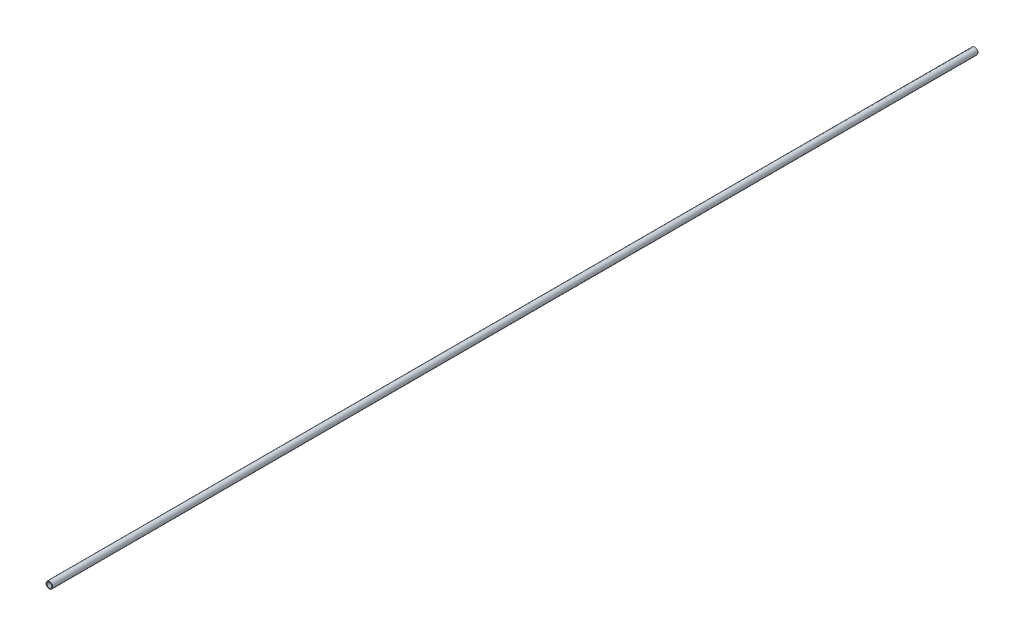
ISO-10303-21;
HEADER;
FILE_DESCRIPTION(('STEP AP214'),'2;1');
FILE_NAME('part.step','',(''),(''),'','','');
FILE_SCHEMA(('AUTOMOTIVE_DESIGN { 1 0 10303 214 1 1 1 1 }'));
ENDSEC;
DATA;
#1=APPLICATION_CONTEXT('core data for automotive mechanical design processes');
#2=APPLICATION_PROTOCOL_DEFINITION('international standard','automotive_design',2000,#1);
#3=PRODUCT_CONTEXT('',#1,'mechanical');
#4=PRODUCT('Part','Part','',(#3));
#5=PRODUCT_RELATED_PRODUCT_CATEGORY('part','',(#4));
#6=PRODUCT_DEFINITION_FORMATION('','',#4);
#7=PRODUCT_DEFINITION_CONTEXT('part definition',#1,'design');
#8=PRODUCT_DEFINITION('design','',#6,#7);
#9=PRODUCT_DEFINITION_SHAPE('','',#8);
#10=(LENGTH_UNIT() NAMED_UNIT(*) SI_UNIT(.MILLI.,.METRE.));
#11=(NAMED_UNIT(*) PLANE_ANGLE_UNIT() SI_UNIT($,.RADIAN.));
#12=(NAMED_UNIT(*) SI_UNIT($,.STERADIAN.) SOLID_ANGLE_UNIT());
#13=UNCERTAINTY_MEASURE_WITH_UNIT(LENGTH_MEASURE(1.E-05),#10,'distance_accuracy_value','');
#14=(GEOMETRIC_REPRESENTATION_CONTEXT(3) GLOBAL_UNCERTAINTY_ASSIGNED_CONTEXT((#13)) GLOBAL_UNIT_ASSIGNED_CONTEXT((#10,
#11,#12)) REPRESENTATION_CONTEXT('',''));
#15=CARTESIAN_POINT('',(0.,0.,0.));
#16=DIRECTION('',(0.,0.,1.));
#17=DIRECTION('',(1.,0.,0.));
#18=AXIS2_PLACEMENT_3D('',#15,#16,#17);
#19=CARTESIAN_POINT('',(0.,0.,1500.));
#20=DIRECTION('',(0.,0.,1.));
#21=DIRECTION('',(1.,0.,0.));
#22=AXIS2_PLACEMENT_3D('',#19,#20,#21);
#23=PLANE('',#22);
#24=CARTESIAN_POINT('',(0.,0.,1500.));
#25=DIRECTION('',(0.,0.,1.));
#26=DIRECTION('',(1.,0.,0.));
#27=AXIS2_PLACEMENT_3D('',#24,#25,#26);
#28=CIRCLE('',#27,10.668);
#29=CARTESIAN_POINT('',(10.668,0.,1500.));
#30=VERTEX_POINT('',#29);
#31=EDGE_CURVE('E11',#30,#30,#28,.T.);
#32=ORIENTED_EDGE('',*,*,#31,.T.);
#33=EDGE_LOOP('',(#32));
#34=FACE_BOUND('',#33,.T.);
#35=CARTESIAN_POINT('',(0.,0.,1500.));
#36=DIRECTION('',(0.,0.,1.));
#37=DIRECTION('',(1.,0.,0.));
#38=AXIS2_PLACEMENT_3D('',#35,#36,#37);
#39=CIRCLE('',#38,7.8994);
#40=CARTESIAN_POINT('',(7.8994,0.,1500.));
#41=VERTEX_POINT('',#40);
#42=EDGE_CURVE('E56',#41,#41,#39,.T.);
#43=ORIENTED_EDGE('',*,*,#42,.F.);
#44=EDGE_LOOP('',(#43));
#45=FACE_BOUND('',#44,.T.);
#46=ADVANCED_FACE('F43',(#34,#45),#23,.T.);
#47=CARTESIAN_POINT('',(0.,0.,-1500.));
#48=DIRECTION('',(0.,0.,1.));
#49=DIRECTION('',(1.,0.,0.));
#50=AXIS2_PLACEMENT_3D('',#47,#48,#49);
#51=PLANE('',#50);
#52=CARTESIAN_POINT('',(0.,0.,-1500.));
#53=DIRECTION('',(0.,0.,1.));
#54=DIRECTION('',(1.,0.,0.));
#55=AXIS2_PLACEMENT_3D('',#52,#53,#54);
#56=CIRCLE('',#55,10.668);
#57=CARTESIAN_POINT('',(10.668,0.,-1500.));
#58=VERTEX_POINT('',#57);
#59=EDGE_CURVE('E47',#58,#58,#56,.T.);
#60=ORIENTED_EDGE('',*,*,#59,.F.);
#61=EDGE_LOOP('',(#60));
#62=FACE_BOUND('',#61,.T.);
#63=CARTESIAN_POINT('',(0.,0.,-1500.));
#64=DIRECTION('',(0.,0.,1.));
#65=DIRECTION('',(1.,0.,0.));
#66=AXIS2_PLACEMENT_3D('',#63,#64,#65);
#67=CIRCLE('',#66,7.8994);
#68=CARTESIAN_POINT('',(7.8994,0.,-1500.));
#69=VERTEX_POINT('',#68);
#70=EDGE_CURVE('E58',#69,#69,#67,.T.);
#71=ORIENTED_EDGE('',*,*,#70,.T.);
#72=EDGE_LOOP('',(#71));
#73=FACE_BOUND('',#72,.T.);
#74=ADVANCED_FACE('F70',(#62,#73),#51,.F.);
#75=CARTESIAN_POINT('',(0.,0.,1500.));
#76=DIRECTION('',(0.,0.,-1.));
#77=DIRECTION('',(-1.,0.,0.));
#78=AXIS2_PLACEMENT_3D('',#75,#76,#77);
#79=CYLINDRICAL_SURFACE('',#78,10.668);
#80=ORIENTED_EDGE('',*,*,#31,.F.);
#81=EDGE_LOOP('',(#80));
#82=FACE_BOUND('',#81,.T.);
#83=ORIENTED_EDGE('',*,*,#59,.T.);
#84=EDGE_LOOP('',(#83));
#85=FACE_BOUND('',#84,.T.);
#86=ADVANCED_FACE('F45',(#82,#85),#79,.T.);
#87=CARTESIAN_POINT('',(0.,0.,1500.));
#88=DIRECTION('',(0.,0.,-1.));
#89=DIRECTION('',(-1.,0.,0.));
#90=AXIS2_PLACEMENT_3D('',#87,#88,#89);
#91=CYLINDRICAL_SURFACE('',#90,7.8994);
#92=ORIENTED_EDGE('',*,*,#42,.T.);
#93=EDGE_LOOP('',(#92));
#94=FACE_BOUND('',#93,.T.);
#95=ORIENTED_EDGE('',*,*,#70,.F.);
#96=EDGE_LOOP('',(#95));
#97=FACE_BOUND('',#96,.T.);
#98=ADVANCED_FACE('F66',(#94,#97),#91,.F.);
#99=CLOSED_SHELL('',(#46,#74,#86,#98));
#100=MANIFOLD_SOLID_BREP('B2',#99);
#101=ADVANCED_BREP_SHAPE_REPRESENTATION('',(#18,#100),#14);
#102=SHAPE_DEFINITION_REPRESENTATION(#9,#101);
ENDSEC;
END-ISO-10303-21;
